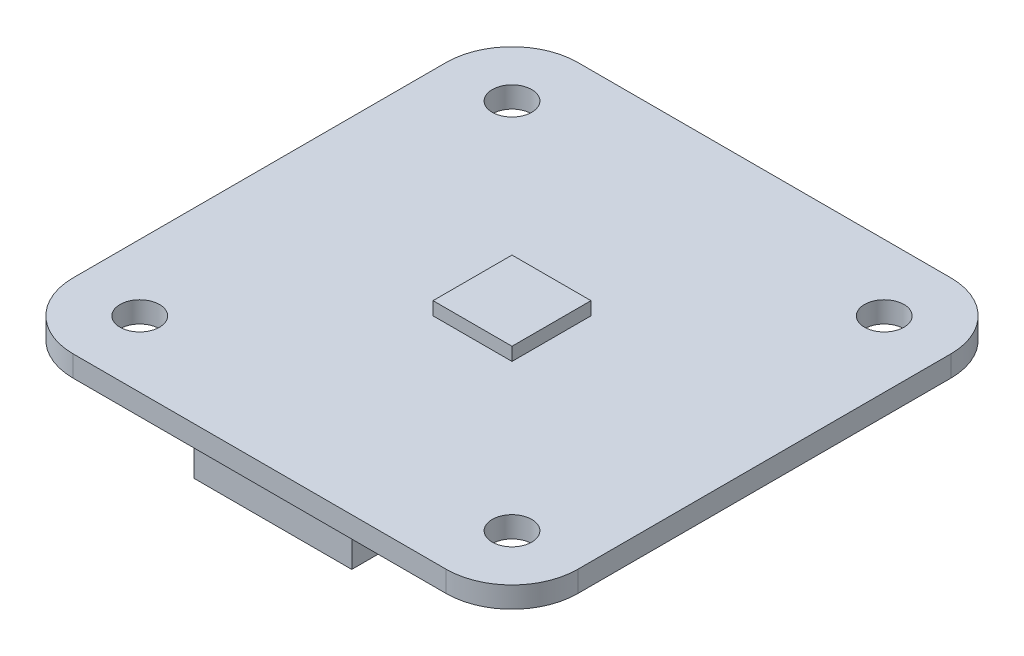
ISO-10303-21;
HEADER;
FILE_DESCRIPTION(('STEP AP214'),'2;1');
FILE_NAME('part.step','',(''),(''),'','','');
FILE_SCHEMA(('AUTOMOTIVE_DESIGN { 1 0 10303 214 1 1 1 1 }'));
ENDSEC;
DATA;
#1=APPLICATION_CONTEXT('core data for automotive mechanical design processes');
#2=APPLICATION_PROTOCOL_DEFINITION('international standard','automotive_design',2000,#1);
#3=PRODUCT_CONTEXT('',#1,'mechanical');
#4=PRODUCT('Part','Part','',(#3));
#5=PRODUCT_RELATED_PRODUCT_CATEGORY('part','',(#4));
#6=PRODUCT_DEFINITION_FORMATION('','',#4);
#7=PRODUCT_DEFINITION_CONTEXT('part definition',#1,'design');
#8=PRODUCT_DEFINITION('design','',#6,#7);
#9=PRODUCT_DEFINITION_SHAPE('','',#8);
#10=(LENGTH_UNIT() NAMED_UNIT(*) SI_UNIT(.MILLI.,.METRE.));
#11=(NAMED_UNIT(*) PLANE_ANGLE_UNIT() SI_UNIT($,.RADIAN.));
#12=(NAMED_UNIT(*) SI_UNIT($,.STERADIAN.) SOLID_ANGLE_UNIT());
#13=UNCERTAINTY_MEASURE_WITH_UNIT(LENGTH_MEASURE(1.E-05),#10,'distance_accuracy_value','');
#14=(GEOMETRIC_REPRESENTATION_CONTEXT(3) GLOBAL_UNCERTAINTY_ASSIGNED_CONTEXT((#13)) GLOBAL_UNIT_ASSIGNED_CONTEXT((#10,
#11,#12)) REPRESENTATION_CONTEXT('',''));
#15=CARTESIAN_POINT('',(0.,0.,0.));
#16=DIRECTION('',(0.,0.,1.));
#17=DIRECTION('',(1.,0.,0.));
#18=AXIS2_PLACEMENT_3D('',#15,#16,#17);
#19=CARTESIAN_POINT('',(0.,0.,0.));
#20=DIRECTION('',(0.,1.,0.));
#21=DIRECTION('',(0.,0.,1.));
#22=AXIS2_PLACEMENT_3D('',#19,#20,#21);
#23=PLANE('',#22);
#24=DIRECTION('',(0.,0.,1.));
#25=VECTOR('',#24,1.);
#26=CARTESIAN_POINT('',(-19.175,0.,-19.175));
#27=LINE('',#26,#25);
#28=CARTESIAN_POINT('',(-19.175,0.,-14.175));
#29=VERTEX_POINT('',#28);
#30=CARTESIAN_POINT('',(-19.175,0.,14.175));
#31=VERTEX_POINT('',#30);
#32=EDGE_CURVE('E251',#29,#31,#27,.T.);
#33=ORIENTED_EDGE('',*,*,#32,.F.);
#34=CARTESIAN_POINT('',(-14.175,0.,-14.175));
#35=DIRECTION('',(0.,1.,0.));
#36=DIRECTION('',(0.,0.,1.));
#37=AXIS2_PLACEMENT_3D('',#34,#35,#36);
#38=CIRCLE('',#37,5.);
#39=CARTESIAN_POINT('',(-14.175,0.,-19.175));
#40=VERTEX_POINT('',#39);
#41=EDGE_CURVE('E266',#29,#40,#38,.F.);
#42=ORIENTED_EDGE('',*,*,#41,.T.);
#43=DIRECTION('',(-1.,0.,0.));
#44=VECTOR('',#43,1.);
#45=CARTESIAN_POINT('',(-19.175,0.,-19.175));
#46=LINE('',#45,#44);
#47=CARTESIAN_POINT('',(14.175,0.,-19.175));
#48=VERTEX_POINT('',#47);
#49=EDGE_CURVE('E248',#48,#40,#46,.T.);
#50=ORIENTED_EDGE('',*,*,#49,.F.);
#51=CARTESIAN_POINT('',(14.175,0.,-14.175));
#52=DIRECTION('',(0.,1.,0.));
#53=DIRECTION('',(0.,0.,1.));
#54=AXIS2_PLACEMENT_3D('',#51,#52,#53);
#55=CIRCLE('',#54,5.);
#56=CARTESIAN_POINT('',(19.175,0.,-14.175));
#57=VERTEX_POINT('',#56);
#58=EDGE_CURVE('E262',#48,#57,#55,.F.);
#59=ORIENTED_EDGE('',*,*,#58,.T.);
#60=DIRECTION('',(0.,0.,-1.));
#61=VECTOR('',#60,1.);
#62=CARTESIAN_POINT('',(19.175,0.,-19.175));
#63=LINE('',#62,#61);
#64=CARTESIAN_POINT('',(19.175,0.,14.175));
#65=VERTEX_POINT('',#64);
#66=EDGE_CURVE('E229',#65,#57,#63,.T.);
#67=ORIENTED_EDGE('',*,*,#66,.F.);
#68=CARTESIAN_POINT('',(14.175,0.,14.175));
#69=DIRECTION('',(0.,1.,0.));
#70=DIRECTION('',(0.,0.,1.));
#71=AXIS2_PLACEMENT_3D('',#68,#69,#70);
#72=CIRCLE('',#71,5.);
#73=CARTESIAN_POINT('',(14.175,0.,19.175));
#74=VERTEX_POINT('',#73);
#75=EDGE_CURVE('E260',#65,#74,#72,.F.);
#76=ORIENTED_EDGE('',*,*,#75,.T.);
#77=DIRECTION('',(1.,0.,0.));
#78=VECTOR('',#77,1.);
#79=CARTESIAN_POINT('',(-19.175,0.,19.175));
#80=LINE('',#79,#78);
#81=CARTESIAN_POINT('',(-14.175,0.,19.175));
#82=VERTEX_POINT('',#81);
#83=EDGE_CURVE('E236',#82,#74,#80,.T.);
#84=ORIENTED_EDGE('',*,*,#83,.F.);
#85=CARTESIAN_POINT('',(-14.175,0.,14.175));
#86=DIRECTION('',(0.,1.,0.));
#87=DIRECTION('',(0.,0.,1.));
#88=AXIS2_PLACEMENT_3D('',#85,#86,#87);
#89=CIRCLE('',#88,5.);
#90=EDGE_CURVE('E264',#82,#31,#89,.F.);
#91=ORIENTED_EDGE('',*,*,#90,.T.);
#92=EDGE_LOOP('',(#33,#42,#50,#59,#67,#76,#84,#91));
#93=FACE_BOUND('',#92,.T.);
#94=CARTESIAN_POINT('',(-14.142135623731,0.,-14.1421356237309));
#95=DIRECTION('',(0.,1.,0.));
#96=DIRECTION('',(0.,0.,1.));
#97=AXIS2_PLACEMENT_3D('',#94,#95,#96);
#98=CIRCLE('',#97,1.5);
#99=CARTESIAN_POINT('',(-14.142135623731,0.,-12.6421356237309));
#100=VERTEX_POINT('',#99);
#101=EDGE_CURVE('E226',#100,#100,#98,.T.);
#102=ORIENTED_EDGE('',*,*,#101,.T.);
#103=EDGE_LOOP('',(#102));
#104=FACE_BOUND('',#103,.T.);
#105=CARTESIAN_POINT('',(14.142135623731,0.,14.1421356237309));
#106=DIRECTION('',(0.,1.,0.));
#107=DIRECTION('',(0.,0.,1.));
#108=AXIS2_PLACEMENT_3D('',#105,#106,#107);
#109=CIRCLE('',#108,1.5);
#110=CARTESIAN_POINT('',(14.142135623731,0.,15.6421356237309));
#111=VERTEX_POINT('',#110);
#112=EDGE_CURVE('E207',#111,#111,#109,.T.);
#113=ORIENTED_EDGE('',*,*,#112,.T.);
#114=EDGE_LOOP('',(#113));
#115=FACE_BOUND('',#114,.T.);
#116=CARTESIAN_POINT('',(-14.142135623731,0.,14.1421356237309));
#117=DIRECTION('',(0.,1.,0.));
#118=DIRECTION('',(0.,0.,1.));
#119=AXIS2_PLACEMENT_3D('',#116,#117,#118);
#120=CIRCLE('',#119,1.5);
#121=CARTESIAN_POINT('',(-14.142135623731,0.,15.6421356237309));
#122=VERTEX_POINT('',#121);
#123=EDGE_CURVE('E211',#122,#122,#120,.T.);
#124=ORIENTED_EDGE('',*,*,#123,.T.);
#125=EDGE_LOOP('',(#124));
#126=FACE_BOUND('',#125,.T.);
#127=CARTESIAN_POINT('',(14.142135623731,0.,-14.1421356237309));
#128=DIRECTION('',(0.,1.,0.));
#129=DIRECTION('',(0.,0.,1.));
#130=AXIS2_PLACEMENT_3D('',#127,#128,#129);
#131=CIRCLE('',#130,1.5);
#132=CARTESIAN_POINT('',(14.142135623731,0.,-12.6421356237309));
#133=VERTEX_POINT('',#132);
#134=EDGE_CURVE('E218',#133,#133,#131,.T.);
#135=ORIENTED_EDGE('',*,*,#134,.T.);
#136=EDGE_LOOP('',(#135));
#137=FACE_BOUND('',#136,.T.);
#138=DIRECTION('',(0.,0.,1.));
#139=VECTOR('',#138,1.);
#140=CARTESIAN_POINT('',(6.,0.,18.175));
#141=LINE('',#140,#139);
#142=CARTESIAN_POINT('',(6.,0.,10.175));
#143=VERTEX_POINT('',#142);
#144=CARTESIAN_POINT('',(6.,0.,18.175));
#145=VERTEX_POINT('',#144);
#146=EDGE_CURVE('E172',#143,#145,#141,.T.);
#147=ORIENTED_EDGE('',*,*,#146,.F.);
#148=DIRECTION('',(1.,0.,0.));
#149=VECTOR('',#148,1.);
#150=CARTESIAN_POINT('',(-6.,0.,10.175));
#151=LINE('',#150,#149);
#152=CARTESIAN_POINT('',(-6.,0.,10.175));
#153=VERTEX_POINT('',#152);
#154=EDGE_CURVE('E169',#153,#143,#151,.T.);
#155=ORIENTED_EDGE('',*,*,#154,.F.);
#156=DIRECTION('',(0.,0.,-1.));
#157=VECTOR('',#156,1.);
#158=CARTESIAN_POINT('',(-6.,0.,18.175));
#159=LINE('',#158,#157);
#160=CARTESIAN_POINT('',(-6.,0.,18.175));
#161=VERTEX_POINT('',#160);
#162=EDGE_CURVE('E60',#161,#153,#159,.T.);
#163=ORIENTED_EDGE('',*,*,#162,.F.);
#164=DIRECTION('',(-1.,0.,0.));
#165=VECTOR('',#164,1.);
#166=CARTESIAN_POINT('',(-6.,0.,18.175));
#167=LINE('',#166,#165);
#168=EDGE_CURVE('E55',#145,#161,#167,.T.);
#169=ORIENTED_EDGE('',*,*,#168,.F.);
#170=EDGE_LOOP('',(#147,#155,#163,#169));
#171=FACE_BOUND('',#170,.T.);
#172=ADVANCED_FACE('F40',(#93,#104,#115,#126,#137,#171),#23,.F.);
#173=CARTESIAN_POINT('',(0.,1.6,0.));
#174=DIRECTION('',(0.,1.,0.));
#175=DIRECTION('',(0.,0.,1.));
#176=AXIS2_PLACEMENT_3D('',#173,#174,#175);
#177=PLANE('',#176);
#178=CARTESIAN_POINT('',(14.142135623731,1.6,-14.1421356237309));
#179=DIRECTION('',(0.,1.,0.));
#180=DIRECTION('',(0.,0.,1.));
#181=AXIS2_PLACEMENT_3D('',#178,#179,#180);
#182=CIRCLE('',#181,1.5);
#183=CARTESIAN_POINT('',(14.142135623731,1.6,-12.6421356237309));
#184=VERTEX_POINT('',#183);
#185=EDGE_CURVE('E214',#184,#184,#182,.T.);
#186=ORIENTED_EDGE('',*,*,#185,.F.);
#187=EDGE_LOOP('',(#186));
#188=FACE_BOUND('',#187,.T.);
#189=CARTESIAN_POINT('',(-14.142135623731,1.6,14.1421356237309));
#190=DIRECTION('',(0.,1.,0.));
#191=DIRECTION('',(0.,0.,1.));
#192=AXIS2_PLACEMENT_3D('',#189,#190,#191);
#193=CIRCLE('',#192,1.5);
#194=CARTESIAN_POINT('',(-14.142135623731,1.6,15.6421356237309));
#195=VERTEX_POINT('',#194);
#196=EDGE_CURVE('E221',#195,#195,#193,.T.);
#197=ORIENTED_EDGE('',*,*,#196,.F.);
#198=EDGE_LOOP('',(#197));
#199=FACE_BOUND('',#198,.T.);
#200=CARTESIAN_POINT('',(14.142135623731,1.6,14.1421356237309));
#201=DIRECTION('',(0.,1.,0.));
#202=DIRECTION('',(0.,0.,1.));
#203=AXIS2_PLACEMENT_3D('',#200,#201,#202);
#204=CIRCLE('',#203,1.5);
#205=CARTESIAN_POINT('',(14.142135623731,1.6,15.6421356237309));
#206=VERTEX_POINT('',#205);
#207=EDGE_CURVE('E208',#206,#206,#204,.T.);
#208=ORIENTED_EDGE('',*,*,#207,.F.);
#209=EDGE_LOOP('',(#208));
#210=FACE_BOUND('',#209,.T.);
#211=CARTESIAN_POINT('',(-14.142135623731,1.6,-14.1421356237309));
#212=DIRECTION('',(0.,1.,0.));
#213=DIRECTION('',(0.,0.,1.));
#214=AXIS2_PLACEMENT_3D('',#211,#212,#213);
#215=CIRCLE('',#214,1.5);
#216=CARTESIAN_POINT('',(-14.142135623731,1.6,-12.6421356237309));
#217=VERTEX_POINT('',#216);
#218=EDGE_CURVE('E217',#217,#217,#215,.T.);
#219=ORIENTED_EDGE('',*,*,#218,.F.);
#220=EDGE_LOOP('',(#219));
#221=FACE_BOUND('',#220,.T.);
#222=DIRECTION('',(-1.,0.,0.));
#223=VECTOR('',#222,1.);
#224=CARTESIAN_POINT('',(-19.175,1.6,-19.175));
#225=LINE('',#224,#223);
#226=CARTESIAN_POINT('',(14.175,1.6,-19.175));
#227=VERTEX_POINT('',#226);
#228=CARTESIAN_POINT('',(-14.175,1.6,-19.175));
#229=VERTEX_POINT('',#228);
#230=EDGE_CURVE('E235',#227,#229,#225,.T.);
#231=ORIENTED_EDGE('',*,*,#230,.T.);
#232=CARTESIAN_POINT('',(-14.175,1.6,-14.175));
#233=DIRECTION('',(0.,1.,0.));
#234=DIRECTION('',(0.,0.,1.));
#235=AXIS2_PLACEMENT_3D('',#232,#233,#234);
#236=CIRCLE('',#235,5.);
#237=CARTESIAN_POINT('',(-19.175,1.6,-14.175));
#238=VERTEX_POINT('',#237);
#239=EDGE_CURVE('E279',#229,#238,#236,.T.);
#240=ORIENTED_EDGE('',*,*,#239,.T.);
#241=DIRECTION('',(0.,0.,1.));
#242=VECTOR('',#241,1.);
#243=CARTESIAN_POINT('',(-19.175,1.6,-19.175));
#244=LINE('',#243,#242);
#245=CARTESIAN_POINT('',(-19.175,1.6,14.175));
#246=VERTEX_POINT('',#245);
#247=EDGE_CURVE('E239',#238,#246,#244,.T.);
#248=ORIENTED_EDGE('',*,*,#247,.T.);
#249=CARTESIAN_POINT('',(-14.175,1.6,14.175));
#250=DIRECTION('',(0.,1.,0.));
#251=DIRECTION('',(0.,0.,1.));
#252=AXIS2_PLACEMENT_3D('',#249,#250,#251);
#253=CIRCLE('',#252,5.);
#254=CARTESIAN_POINT('',(-14.175,1.6,19.175));
#255=VERTEX_POINT('',#254);
#256=EDGE_CURVE('E277',#246,#255,#253,.T.);
#257=ORIENTED_EDGE('',*,*,#256,.T.);
#258=DIRECTION('',(1.,0.,0.));
#259=VECTOR('',#258,1.);
#260=CARTESIAN_POINT('',(-19.175,1.6,19.175));
#261=LINE('',#260,#259);
#262=CARTESIAN_POINT('',(14.175,1.6,19.175));
#263=VERTEX_POINT('',#262);
#264=EDGE_CURVE('E242',#255,#263,#261,.T.);
#265=ORIENTED_EDGE('',*,*,#264,.T.);
#266=CARTESIAN_POINT('',(14.175,1.6,14.175));
#267=DIRECTION('',(0.,1.,0.));
#268=DIRECTION('',(0.,0.,1.));
#269=AXIS2_PLACEMENT_3D('',#266,#267,#268);
#270=CIRCLE('',#269,5.);
#271=CARTESIAN_POINT('',(19.175,1.6,14.175));
#272=VERTEX_POINT('',#271);
#273=EDGE_CURVE('E273',#263,#272,#270,.T.);
#274=ORIENTED_EDGE('',*,*,#273,.T.);
#275=DIRECTION('',(0.,0.,-1.));
#276=VECTOR('',#275,1.);
#277=CARTESIAN_POINT('',(19.175,1.6,-19.175));
#278=LINE('',#277,#276);
#279=CARTESIAN_POINT('',(19.175,1.6,-14.175));
#280=VERTEX_POINT('',#279);
#281=EDGE_CURVE('E232',#272,#280,#278,.T.);
#282=ORIENTED_EDGE('',*,*,#281,.T.);
#283=CARTESIAN_POINT('',(14.175,1.6,-14.175));
#284=DIRECTION('',(0.,1.,0.));
#285=DIRECTION('',(0.,0.,1.));
#286=AXIS2_PLACEMENT_3D('',#283,#284,#285);
#287=CIRCLE('',#286,5.);
#288=EDGE_CURVE('E275',#280,#227,#287,.T.);
#289=ORIENTED_EDGE('',*,*,#288,.T.);
#290=EDGE_LOOP('',(#231,#240,#248,#257,#265,#274,#282,#289));
#291=FACE_BOUND('',#290,.T.);
#292=DIRECTION('',(-1.,0.,0.));
#293=VECTOR('',#292,1.);
#294=CARTESIAN_POINT('',(-3.,1.6,-3.));
#295=LINE('',#294,#293);
#296=CARTESIAN_POINT('',(3.,1.6,-3.));
#297=VERTEX_POINT('',#296);
#298=CARTESIAN_POINT('',(-3.,1.6,-3.));
#299=VERTEX_POINT('',#298);
#300=EDGE_CURVE('E176',#297,#299,#295,.T.);
#301=ORIENTED_EDGE('',*,*,#300,.F.);
#302=DIRECTION('',(0.,0.,-1.));
#303=VECTOR('',#302,1.);
#304=CARTESIAN_POINT('',(3.,1.6,-3.));
#305=LINE('',#304,#303);
#306=CARTESIAN_POINT('',(3.,1.6,3.));
#307=VERTEX_POINT('',#306);
#308=EDGE_CURVE('E173',#307,#297,#305,.T.);
#309=ORIENTED_EDGE('',*,*,#308,.F.);
#310=DIRECTION('',(1.,0.,0.));
#311=VECTOR('',#310,1.);
#312=CARTESIAN_POINT('',(-3.,1.6,3.));
#313=LINE('',#312,#311);
#314=CARTESIAN_POINT('',(-3.,1.6,3.));
#315=VERTEX_POINT('',#314);
#316=EDGE_CURVE('E186',#315,#307,#313,.T.);
#317=ORIENTED_EDGE('',*,*,#316,.F.);
#318=DIRECTION('',(0.,0.,1.));
#319=VECTOR('',#318,1.);
#320=CARTESIAN_POINT('',(-3.,1.6,-3.));
#321=LINE('',#320,#319);
#322=EDGE_CURVE('E194',#299,#315,#321,.T.);
#323=ORIENTED_EDGE('',*,*,#322,.F.);
#324=EDGE_LOOP('',(#301,#309,#317,#323));
#325=FACE_BOUND('',#324,.T.);
#326=ADVANCED_FACE('F309',(#188,#199,#210,#221,#291,#325),#177,.T.);
#327=CARTESIAN_POINT('',(19.175,1.6,-19.175));
#328=DIRECTION('',(-1.,0.,0.));
#329=DIRECTION('',(0.,0.,1.));
#330=AXIS2_PLACEMENT_3D('',#327,#328,#329);
#331=PLANE('',#330);
#332=ORIENTED_EDGE('',*,*,#66,.T.);
#333=DIRECTION('',(0.,-1.,0.));
#334=VECTOR('',#333,1.);
#335=CARTESIAN_POINT('',(19.175,1.6,-14.175));
#336=LINE('',#335,#334);
#337=EDGE_CURVE('E11',#57,#280,#336,.F.);
#338=ORIENTED_EDGE('',*,*,#337,.T.);
#339=ORIENTED_EDGE('',*,*,#281,.F.);
#340=DIRECTION('',(0.,-1.,0.));
#341=VECTOR('',#340,1.);
#342=CARTESIAN_POINT('',(19.175,1.6,14.175));
#343=LINE('',#342,#341);
#344=EDGE_CURVE('E48',#272,#65,#343,.T.);
#345=ORIENTED_EDGE('',*,*,#344,.T.);
#346=EDGE_LOOP('',(#332,#338,#339,#345));
#347=FACE_BOUND('',#346,.T.);
#348=ADVANCED_FACE('F290',(#347),#331,.F.);
#349=CARTESIAN_POINT('',(-19.175,1.6,-19.175));
#350=DIRECTION('',(0.,0.,1.));
#351=DIRECTION('',(1.,0.,0.));
#352=AXIS2_PLACEMENT_3D('',#349,#350,#351);
#353=PLANE('',#352);
#354=ORIENTED_EDGE('',*,*,#49,.T.);
#355=DIRECTION('',(0.,-1.,0.));
#356=VECTOR('',#355,1.);
#357=CARTESIAN_POINT('',(-14.175,1.6,-19.175));
#358=LINE('',#357,#356);
#359=EDGE_CURVE('E271',#40,#229,#358,.F.);
#360=ORIENTED_EDGE('',*,*,#359,.T.);
#361=ORIENTED_EDGE('',*,*,#230,.F.);
#362=DIRECTION('',(0.,-1.,0.));
#363=VECTOR('',#362,1.);
#364=CARTESIAN_POINT('',(14.175,1.6,-19.175));
#365=LINE('',#364,#363);
#366=EDGE_CURVE('E268',#227,#48,#365,.T.);
#367=ORIENTED_EDGE('',*,*,#366,.T.);
#368=EDGE_LOOP('',(#354,#360,#361,#367));
#369=FACE_BOUND('',#368,.T.);
#370=ADVANCED_FACE('F305',(#369),#353,.F.);
#371=CARTESIAN_POINT('',(-19.175,1.6,-19.175));
#372=DIRECTION('',(1.,0.,0.));
#373=DIRECTION('',(0.,0.,-1.));
#374=AXIS2_PLACEMENT_3D('',#371,#372,#373);
#375=PLANE('',#374);
#376=ORIENTED_EDGE('',*,*,#247,.F.);
#377=DIRECTION('',(0.,-1.,0.));
#378=VECTOR('',#377,1.);
#379=CARTESIAN_POINT('',(-19.175,1.6,-14.175));
#380=LINE('',#379,#378);
#381=EDGE_CURVE('E257',#238,#29,#380,.T.);
#382=ORIENTED_EDGE('',*,*,#381,.T.);
#383=ORIENTED_EDGE('',*,*,#32,.T.);
#384=DIRECTION('',(0.,-1.,0.));
#385=VECTOR('',#384,1.);
#386=CARTESIAN_POINT('',(-19.175,1.6,14.175));
#387=LINE('',#386,#385);
#388=EDGE_CURVE('E245',#31,#246,#387,.F.);
#389=ORIENTED_EDGE('',*,*,#388,.T.);
#390=EDGE_LOOP('',(#376,#382,#383,#389));
#391=FACE_BOUND('',#390,.T.);
#392=ADVANCED_FACE('F316',(#391),#375,.F.);
#393=CARTESIAN_POINT('',(-19.175,1.6,19.175));
#394=DIRECTION('',(0.,0.,-1.));
#395=DIRECTION('',(-1.,0.,0.));
#396=AXIS2_PLACEMENT_3D('',#393,#394,#395);
#397=PLANE('',#396);
#398=ORIENTED_EDGE('',*,*,#264,.F.);
#399=DIRECTION('',(0.,-1.,0.));
#400=VECTOR('',#399,1.);
#401=CARTESIAN_POINT('',(-14.175,1.6,19.175));
#402=LINE('',#401,#400);
#403=EDGE_CURVE('E283',#255,#82,#402,.T.);
#404=ORIENTED_EDGE('',*,*,#403,.T.);
#405=ORIENTED_EDGE('',*,*,#83,.T.);
#406=DIRECTION('',(0.,-1.,0.));
#407=VECTOR('',#406,1.);
#408=CARTESIAN_POINT('',(14.175,1.6,19.175));
#409=LINE('',#408,#407);
#410=EDGE_CURVE('E281',#74,#263,#409,.F.);
#411=ORIENTED_EDGE('',*,*,#410,.T.);
#412=EDGE_LOOP('',(#398,#404,#405,#411));
#413=FACE_BOUND('',#412,.T.);
#414=ADVANCED_FACE('F324',(#413),#397,.F.);
#415=CARTESIAN_POINT('',(-14.175,1.6,-14.175));
#416=DIRECTION('',(0.,-1.,0.));
#417=DIRECTION('',(0.,0.,-1.));
#418=AXIS2_PLACEMENT_3D('',#415,#416,#417);
#419=CYLINDRICAL_SURFACE('',#418,5.);
#420=ORIENTED_EDGE('',*,*,#239,.F.);
#421=ORIENTED_EDGE('',*,*,#359,.F.);
#422=ORIENTED_EDGE('',*,*,#41,.F.);
#423=ORIENTED_EDGE('',*,*,#381,.F.);
#424=EDGE_LOOP('',(#420,#421,#422,#423));
#425=FACE_BOUND('',#424,.T.);
#426=ADVANCED_FACE('F314',(#425),#419,.T.);
#427=CARTESIAN_POINT('',(-14.175,1.6,14.175));
#428=DIRECTION('',(0.,-1.,0.));
#429=DIRECTION('',(0.,0.,-1.));
#430=AXIS2_PLACEMENT_3D('',#427,#428,#429);
#431=CYLINDRICAL_SURFACE('',#430,5.);
#432=ORIENTED_EDGE('',*,*,#256,.F.);
#433=ORIENTED_EDGE('',*,*,#388,.F.);
#434=ORIENTED_EDGE('',*,*,#90,.F.);
#435=ORIENTED_EDGE('',*,*,#403,.F.);
#436=EDGE_LOOP('',(#432,#433,#434,#435));
#437=FACE_BOUND('',#436,.T.);
#438=ADVANCED_FACE('F321',(#437),#431,.T.);
#439=CARTESIAN_POINT('',(14.175,1.6,-14.175));
#440=DIRECTION('',(0.,-1.,0.));
#441=DIRECTION('',(0.,0.,-1.));
#442=AXIS2_PLACEMENT_3D('',#439,#440,#441);
#443=CYLINDRICAL_SURFACE('',#442,5.);
#444=ORIENTED_EDGE('',*,*,#288,.F.);
#445=ORIENTED_EDGE('',*,*,#337,.F.);
#446=ORIENTED_EDGE('',*,*,#58,.F.);
#447=ORIENTED_EDGE('',*,*,#366,.F.);
#448=EDGE_LOOP('',(#444,#445,#446,#447));
#449=FACE_BOUND('',#448,.T.);
#450=ADVANCED_FACE('F302',(#449),#443,.T.);
#451=CARTESIAN_POINT('',(14.175,1.6,14.175));
#452=DIRECTION('',(0.,-1.,0.));
#453=DIRECTION('',(0.,0.,-1.));
#454=AXIS2_PLACEMENT_3D('',#451,#452,#453);
#455=CYLINDRICAL_SURFACE('',#454,5.);
#456=ORIENTED_EDGE('',*,*,#273,.F.);
#457=ORIENTED_EDGE('',*,*,#410,.F.);
#458=ORIENTED_EDGE('',*,*,#75,.F.);
#459=ORIENTED_EDGE('',*,*,#344,.F.);
#460=EDGE_LOOP('',(#456,#457,#458,#459));
#461=FACE_BOUND('',#460,.T.);
#462=ADVANCED_FACE('F42',(#461),#455,.T.);
#463=CARTESIAN_POINT('',(-14.142135623731,0.,-14.1421356237309));
#464=DIRECTION('',(0.,1.,0.));
#465=DIRECTION('',(0.,0.,1.));
#466=AXIS2_PLACEMENT_3D('',#463,#464,#465);
#467=CYLINDRICAL_SURFACE('',#466,1.5);
#468=ORIENTED_EDGE('',*,*,#101,.F.);
#469=EDGE_LOOP('',(#468));
#470=FACE_BOUND('',#469,.T.);
#471=ORIENTED_EDGE('',*,*,#218,.T.);
#472=EDGE_LOOP('',(#471));
#473=FACE_BOUND('',#472,.T.);
#474=ADVANCED_FACE('F327',(#470,#473),#467,.F.);
#475=CARTESIAN_POINT('',(14.142135623731,0.,14.1421356237309));
#476=DIRECTION('',(0.,1.,0.));
#477=DIRECTION('',(0.,0.,1.));
#478=AXIS2_PLACEMENT_3D('',#475,#476,#477);
#479=CYLINDRICAL_SURFACE('',#478,1.5);
#480=ORIENTED_EDGE('',*,*,#112,.F.);
#481=EDGE_LOOP('',(#480));
#482=FACE_BOUND('',#481,.T.);
#483=ORIENTED_EDGE('',*,*,#207,.T.);
#484=EDGE_LOOP('',(#483));
#485=FACE_BOUND('',#484,.T.);
#486=ADVANCED_FACE('F332',(#482,#485),#479,.F.);
#487=CARTESIAN_POINT('',(-14.142135623731,0.,14.1421356237309));
#488=DIRECTION('',(0.,1.,0.));
#489=DIRECTION('',(0.,0.,1.));
#490=AXIS2_PLACEMENT_3D('',#487,#488,#489);
#491=CYLINDRICAL_SURFACE('',#490,1.5);
#492=ORIENTED_EDGE('',*,*,#123,.F.);
#493=EDGE_LOOP('',(#492));
#494=FACE_BOUND('',#493,.T.);
#495=ORIENTED_EDGE('',*,*,#196,.T.);
#496=EDGE_LOOP('',(#495));
#497=FACE_BOUND('',#496,.T.);
#498=ADVANCED_FACE('F385',(#494,#497),#491,.F.);
#499=CARTESIAN_POINT('',(14.142135623731,0.,-14.1421356237309));
#500=DIRECTION('',(0.,1.,0.));
#501=DIRECTION('',(0.,0.,1.));
#502=AXIS2_PLACEMENT_3D('',#499,#500,#501);
#503=CYLINDRICAL_SURFACE('',#502,1.5);
#504=ORIENTED_EDGE('',*,*,#134,.F.);
#505=EDGE_LOOP('',(#504));
#506=FACE_BOUND('',#505,.T.);
#507=ORIENTED_EDGE('',*,*,#185,.T.);
#508=EDGE_LOOP('',(#507));
#509=FACE_BOUND('',#508,.T.);
#510=ADVANCED_FACE('F395',(#506,#509),#503,.F.);
#511=CARTESIAN_POINT('',(3.,2.6,-3.));
#512=DIRECTION('',(-1.,0.,0.));
#513=DIRECTION('',(0.,0.,1.));
#514=AXIS2_PLACEMENT_3D('',#511,#512,#513);
#515=PLANE('',#514);
#516=ORIENTED_EDGE('',*,*,#308,.T.);
#517=DIRECTION('',(0.,-1.,0.));
#518=VECTOR('',#517,1.);
#519=CARTESIAN_POINT('',(3.,2.6,-3.));
#520=LINE('',#519,#518);
#521=CARTESIAN_POINT('',(3.,2.6,-3.));
#522=VERTEX_POINT('',#521);
#523=EDGE_CURVE('E205',#522,#297,#520,.T.);
#524=ORIENTED_EDGE('',*,*,#523,.F.);
#525=DIRECTION('',(0.,0.,-1.));
#526=VECTOR('',#525,1.);
#527=CARTESIAN_POINT('',(3.,2.6,-3.));
#528=LINE('',#527,#526);
#529=CARTESIAN_POINT('',(3.,2.6,3.));
#530=VERTEX_POINT('',#529);
#531=EDGE_CURVE('E182',#530,#522,#528,.T.);
#532=ORIENTED_EDGE('',*,*,#531,.F.);
#533=DIRECTION('',(0.,-1.,0.));
#534=VECTOR('',#533,1.);
#535=CARTESIAN_POINT('',(3.,2.6,3.));
#536=LINE('',#535,#534);
#537=EDGE_CURVE('E191',#530,#307,#536,.T.);
#538=ORIENTED_EDGE('',*,*,#537,.T.);
#539=EDGE_LOOP('',(#516,#524,#532,#538));
#540=FACE_BOUND('',#539,.T.);
#541=ADVANCED_FACE('F405',(#540),#515,.F.);
#542=CARTESIAN_POINT('',(-3.,2.6,-3.));
#543=DIRECTION('',(0.,0.,1.));
#544=DIRECTION('',(1.,0.,0.));
#545=AXIS2_PLACEMENT_3D('',#542,#543,#544);
#546=PLANE('',#545);
#547=ORIENTED_EDGE('',*,*,#300,.T.);
#548=DIRECTION('',(0.,-1.,0.));
#549=VECTOR('',#548,1.);
#550=CARTESIAN_POINT('',(-3.,2.6,-3.));
#551=LINE('',#550,#549);
#552=CARTESIAN_POINT('',(-3.,2.6,-3.));
#553=VERTEX_POINT('',#552);
#554=EDGE_CURVE('E202',#553,#299,#551,.T.);
#555=ORIENTED_EDGE('',*,*,#554,.F.);
#556=DIRECTION('',(-1.,0.,0.));
#557=VECTOR('',#556,1.);
#558=CARTESIAN_POINT('',(-3.,2.6,-3.));
#559=LINE('',#558,#557);
#560=EDGE_CURVE('E185',#522,#553,#559,.T.);
#561=ORIENTED_EDGE('',*,*,#560,.F.);
#562=ORIENTED_EDGE('',*,*,#523,.T.);
#563=EDGE_LOOP('',(#547,#555,#561,#562));
#564=FACE_BOUND('',#563,.T.);
#565=ADVANCED_FACE('F420',(#564),#546,.F.);
#566=CARTESIAN_POINT('',(-3.,2.6,-3.));
#567=DIRECTION('',(1.,0.,0.));
#568=DIRECTION('',(0.,0.,-1.));
#569=AXIS2_PLACEMENT_3D('',#566,#567,#568);
#570=PLANE('',#569);
#571=ORIENTED_EDGE('',*,*,#322,.T.);
#572=DIRECTION('',(0.,-1.,0.));
#573=VECTOR('',#572,1.);
#574=CARTESIAN_POINT('',(-3.,2.6,3.));
#575=LINE('',#574,#573);
#576=CARTESIAN_POINT('',(-3.,2.6,3.));
#577=VERTEX_POINT('',#576);
#578=EDGE_CURVE('E200',#577,#315,#575,.T.);
#579=ORIENTED_EDGE('',*,*,#578,.F.);
#580=DIRECTION('',(0.,0.,1.));
#581=VECTOR('',#580,1.);
#582=CARTESIAN_POINT('',(-3.,2.6,-3.));
#583=LINE('',#582,#581);
#584=EDGE_CURVE('E188',#553,#577,#583,.T.);
#585=ORIENTED_EDGE('',*,*,#584,.F.);
#586=ORIENTED_EDGE('',*,*,#554,.T.);
#587=EDGE_LOOP('',(#571,#579,#585,#586));
#588=FACE_BOUND('',#587,.T.);
#589=ADVANCED_FACE('F430',(#588),#570,.F.);
#590=CARTESIAN_POINT('',(-3.,2.6,3.));
#591=DIRECTION('',(0.,0.,-1.));
#592=DIRECTION('',(-1.,0.,0.));
#593=AXIS2_PLACEMENT_3D('',#590,#591,#592);
#594=PLANE('',#593);
#595=ORIENTED_EDGE('',*,*,#316,.T.);
#596=ORIENTED_EDGE('',*,*,#537,.F.);
#597=DIRECTION('',(1.,0.,0.));
#598=VECTOR('',#597,1.);
#599=CARTESIAN_POINT('',(-3.,2.6,3.));
#600=LINE('',#599,#598);
#601=EDGE_CURVE('E190',#577,#530,#600,.T.);
#602=ORIENTED_EDGE('',*,*,#601,.F.);
#603=ORIENTED_EDGE('',*,*,#578,.T.);
#604=EDGE_LOOP('',(#595,#596,#602,#603));
#605=FACE_BOUND('',#604,.T.);
#606=ADVANCED_FACE('F440',(#605),#594,.F.);
#607=CARTESIAN_POINT('',(0.,2.6,0.));
#608=DIRECTION('',(0.,1.,0.));
#609=DIRECTION('',(0.,0.,1.));
#610=AXIS2_PLACEMENT_3D('',#607,#608,#609);
#611=PLANE('',#610);
#612=ORIENTED_EDGE('',*,*,#531,.T.);
#613=ORIENTED_EDGE('',*,*,#560,.T.);
#614=ORIENTED_EDGE('',*,*,#584,.T.);
#615=ORIENTED_EDGE('',*,*,#601,.T.);
#616=EDGE_LOOP('',(#612,#613,#614,#615));
#617=FACE_BOUND('',#616,.T.);
#618=ADVANCED_FACE('F450',(#617),#611,.T.);
#619=CARTESIAN_POINT('',(6.,-3.,18.175));
#620=DIRECTION('',(-1.,0.,0.));
#621=DIRECTION('',(0.,0.,1.));
#622=AXIS2_PLACEMENT_3D('',#619,#620,#621);
#623=PLANE('',#622);
#624=ORIENTED_EDGE('',*,*,#146,.T.);
#625=DIRECTION('',(0.,1.,0.));
#626=VECTOR('',#625,1.);
#627=CARTESIAN_POINT('',(6.,-3.,18.175));
#628=LINE('',#627,#626);
#629=CARTESIAN_POINT('',(6.,-3.,18.175));
#630=VERTEX_POINT('',#629);
#631=EDGE_CURVE('E153',#630,#145,#628,.T.);
#632=ORIENTED_EDGE('',*,*,#631,.F.);
#633=DIRECTION('',(0.,0.,1.));
#634=VECTOR('',#633,1.);
#635=CARTESIAN_POINT('',(6.,-3.,18.175));
#636=LINE('',#635,#634);
#637=CARTESIAN_POINT('',(6.,-3.,10.175));
#638=VERTEX_POINT('',#637);
#639=EDGE_CURVE('E160',#638,#630,#636,.T.);
#640=ORIENTED_EDGE('',*,*,#639,.F.);
#641=DIRECTION('',(0.,1.,0.));
#642=VECTOR('',#641,1.);
#643=CARTESIAN_POINT('',(6.,-3.,10.175));
#644=LINE('',#643,#642);
#645=EDGE_CURVE('E511',#638,#143,#644,.T.);
#646=ORIENTED_EDGE('',*,*,#645,.T.);
#647=EDGE_LOOP('',(#624,#632,#640,#646));
#648=FACE_BOUND('',#647,.T.);
#649=ADVANCED_FACE('F171',(#648),#623,.F.);
#650=CARTESIAN_POINT('',(-6.,-3.,18.175));
#651=DIRECTION('',(0.,0.,-1.));
#652=DIRECTION('',(-1.,0.,0.));
#653=AXIS2_PLACEMENT_3D('',#650,#651,#652);
#654=PLANE('',#653);
#655=ORIENTED_EDGE('',*,*,#168,.T.);
#656=DIRECTION('',(0.,1.,0.));
#657=VECTOR('',#656,1.);
#658=CARTESIAN_POINT('',(-6.,-3.,18.175));
#659=LINE('',#658,#657);
#660=CARTESIAN_POINT('',(-6.,-3.,18.175));
#661=VERTEX_POINT('',#660);
#662=EDGE_CURVE('E156',#661,#161,#659,.T.);
#663=ORIENTED_EDGE('',*,*,#662,.F.);
#664=DIRECTION('',(-1.,0.,0.));
#665=VECTOR('',#664,1.);
#666=CARTESIAN_POINT('',(-6.,-3.,18.175));
#667=LINE('',#666,#665);
#668=EDGE_CURVE('E149',#630,#661,#667,.T.);
#669=ORIENTED_EDGE('',*,*,#668,.F.);
#670=ORIENTED_EDGE('',*,*,#631,.T.);
#671=EDGE_LOOP('',(#655,#663,#669,#670));
#672=FACE_BOUND('',#671,.T.);
#673=ADVANCED_FACE('F151',(#672),#654,.F.);
#674=CARTESIAN_POINT('',(-6.,-3.,18.175));
#675=DIRECTION('',(1.,0.,0.));
#676=DIRECTION('',(0.,0.,-1.));
#677=AXIS2_PLACEMENT_3D('',#674,#675,#676);
#678=PLANE('',#677);
#679=ORIENTED_EDGE('',*,*,#162,.T.);
#680=DIRECTION('',(0.,1.,0.));
#681=VECTOR('',#680,1.);
#682=CARTESIAN_POINT('',(-6.,-3.,10.175));
#683=LINE('',#682,#681);
#684=CARTESIAN_POINT('',(-6.,-3.,10.175));
#685=VERTEX_POINT('',#684);
#686=EDGE_CURVE('E178',#685,#153,#683,.T.);
#687=ORIENTED_EDGE('',*,*,#686,.F.);
#688=DIRECTION('',(0.,0.,-1.));
#689=VECTOR('',#688,1.);
#690=CARTESIAN_POINT('',(-6.,-3.,18.175));
#691=LINE('',#690,#689);
#692=EDGE_CURVE('E159',#661,#685,#691,.T.);
#693=ORIENTED_EDGE('',*,*,#692,.F.);
#694=ORIENTED_EDGE('',*,*,#662,.T.);
#695=EDGE_LOOP('',(#679,#687,#693,#694));
#696=FACE_BOUND('',#695,.T.);
#697=ADVANCED_FACE('F479',(#696),#678,.F.);
#698=CARTESIAN_POINT('',(-6.,-3.,10.175));
#699=DIRECTION('',(0.,0.,1.));
#700=DIRECTION('',(1.,0.,0.));
#701=AXIS2_PLACEMENT_3D('',#698,#699,#700);
#702=PLANE('',#701);
#703=ORIENTED_EDGE('',*,*,#154,.T.);
#704=ORIENTED_EDGE('',*,*,#645,.F.);
#705=DIRECTION('',(1.,0.,0.));
#706=VECTOR('',#705,1.);
#707=CARTESIAN_POINT('',(-6.,-3.,10.175));
#708=LINE('',#707,#706);
#709=EDGE_CURVE('E165',#685,#638,#708,.T.);
#710=ORIENTED_EDGE('',*,*,#709,.F.);
#711=ORIENTED_EDGE('',*,*,#686,.T.);
#712=EDGE_LOOP('',(#703,#704,#710,#711));
#713=FACE_BOUND('',#712,.T.);
#714=ADVANCED_FACE('F488',(#713),#702,.F.);
#715=CARTESIAN_POINT('',(0.,-3.,0.));
#716=DIRECTION('',(0.,-1.,0.));
#717=DIRECTION('',(0.,0.,-1.));
#718=AXIS2_PLACEMENT_3D('',#715,#716,#717);
#719=PLANE('',#718);
#720=ORIENTED_EDGE('',*,*,#639,.T.);
#721=ORIENTED_EDGE('',*,*,#668,.T.);
#722=ORIENTED_EDGE('',*,*,#692,.T.);
#723=ORIENTED_EDGE('',*,*,#709,.T.);
#724=EDGE_LOOP('',(#720,#721,#722,#723));
#725=FACE_BOUND('',#724,.T.);
#726=ADVANCED_FACE('F163',(#725),#719,.T.);
#727=CLOSED_SHELL('',(#172,#326,#348,#370,#392,#414,#426,#438,#450,#462,#474,#486,#498,#510,
#541,#565,#589,#606,#618,#649,#673,#697,#714,#726));
#728=MANIFOLD_SOLID_BREP('B2',#727);
#729=ADVANCED_BREP_SHAPE_REPRESENTATION('',(#18,#728),#14);
#730=SHAPE_DEFINITION_REPRESENTATION(#9,#729);
ENDSEC;
END-ISO-10303-21;
